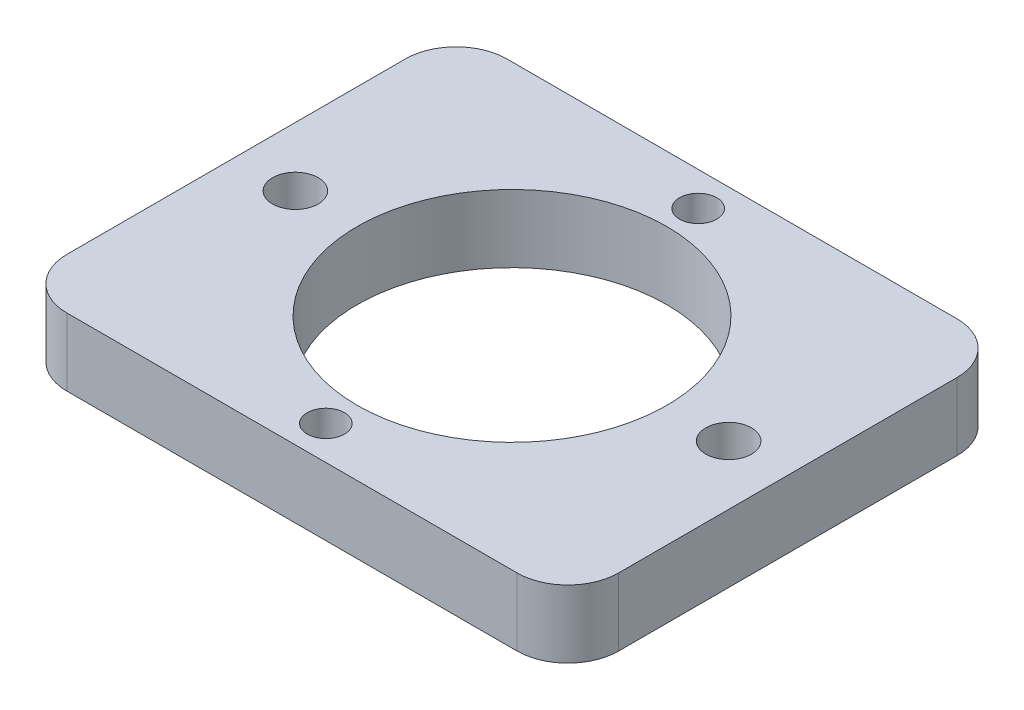
ISO-10303-21;
HEADER;
FILE_DESCRIPTION(('STEP AP214'),'2;1');
FILE_NAME('part.step','',(''),(''),'','','');
FILE_SCHEMA(('AUTOMOTIVE_DESIGN { 1 0 10303 214 1 1 1 1 }'));
ENDSEC;
DATA;
#1=APPLICATION_CONTEXT('core data for automotive mechanical design processes');
#2=APPLICATION_PROTOCOL_DEFINITION('international standard','automotive_design',2000,#1);
#3=PRODUCT_CONTEXT('',#1,'mechanical');
#4=PRODUCT('Part','Part','',(#3));
#5=PRODUCT_RELATED_PRODUCT_CATEGORY('part','',(#4));
#6=PRODUCT_DEFINITION_FORMATION('','',#4);
#7=PRODUCT_DEFINITION_CONTEXT('part definition',#1,'design');
#8=PRODUCT_DEFINITION('design','',#6,#7);
#9=PRODUCT_DEFINITION_SHAPE('','',#8);
#10=(LENGTH_UNIT() NAMED_UNIT(*) SI_UNIT(.MILLI.,.METRE.));
#11=(NAMED_UNIT(*) PLANE_ANGLE_UNIT() SI_UNIT($,.RADIAN.));
#12=(NAMED_UNIT(*) SI_UNIT($,.STERADIAN.) SOLID_ANGLE_UNIT());
#13=UNCERTAINTY_MEASURE_WITH_UNIT(LENGTH_MEASURE(1.E-05),#10,'distance_accuracy_value','');
#14=(GEOMETRIC_REPRESENTATION_CONTEXT(3) GLOBAL_UNCERTAINTY_ASSIGNED_CONTEXT((#13)) GLOBAL_UNIT_ASSIGNED_CONTEXT((#10,
#11,#12)) REPRESENTATION_CONTEXT('',''));
#15=CARTESIAN_POINT('',(0.,0.,0.));
#16=DIRECTION('',(0.,0.,1.));
#17=DIRECTION('',(1.,0.,0.));
#18=AXIS2_PLACEMENT_3D('',#15,#16,#17);
#19=CARTESIAN_POINT('',(0.,4.,0.));
#20=DIRECTION('',(1.,0.,0.));
#21=DIRECTION('',(0.,0.,-1.));
#22=AXIS2_PLACEMENT_3D('',#19,#20,#21);
#23=PLANE('',#22);
#24=DIRECTION('',(0.,0.,1.));
#25=VECTOR('',#24,1.);
#26=CARTESIAN_POINT('',(0.,0.,0.));
#27=LINE('',#26,#25);
#28=CARTESIAN_POINT('',(0.,0.,3.));
#29=VERTEX_POINT('',#28);
#30=CARTESIAN_POINT('',(0.,0.,23.));
#31=VERTEX_POINT('',#30);
#32=EDGE_CURVE('E130',#29,#31,#27,.T.);
#33=ORIENTED_EDGE('',*,*,#32,.T.);
#34=DIRECTION('',(0.,-1.,0.));
#35=VECTOR('',#34,1.);
#36=CARTESIAN_POINT('',(0.,4.,23.));
#37=LINE('',#36,#35);
#38=CARTESIAN_POINT('',(0.,4.,23.));
#39=VERTEX_POINT('',#38);
#40=EDGE_CURVE('E152',#31,#39,#37,.F.);
#41=ORIENTED_EDGE('',*,*,#40,.T.);
#42=DIRECTION('',(0.,0.,1.));
#43=VECTOR('',#42,1.);
#44=CARTESIAN_POINT('',(0.,4.,0.));
#45=LINE('',#44,#43);
#46=CARTESIAN_POINT('',(0.,4.,3.));
#47=VERTEX_POINT('',#46);
#48=EDGE_CURVE('E128',#47,#39,#45,.T.);
#49=ORIENTED_EDGE('',*,*,#48,.F.);
#50=DIRECTION('',(0.,-1.,0.));
#51=VECTOR('',#50,1.);
#52=CARTESIAN_POINT('',(0.,4.,3.));
#53=LINE('',#52,#51);
#54=EDGE_CURVE('E149',#47,#29,#53,.T.);
#55=ORIENTED_EDGE('',*,*,#54,.T.);
#56=EDGE_LOOP('',(#33,#41,#49,#55));
#57=FACE_BOUND('',#56,.T.);
#58=ADVANCED_FACE('F33',(#57),#23,.F.);
#59=CARTESIAN_POINT('',(0.,4.,26.));
#60=DIRECTION('',(0.,0.,-1.));
#61=DIRECTION('',(-1.,0.,0.));
#62=AXIS2_PLACEMENT_3D('',#59,#60,#61);
#63=PLANE('',#62);
#64=DIRECTION('',(1.,0.,0.));
#65=VECTOR('',#64,1.);
#66=CARTESIAN_POINT('',(0.,0.,26.));
#67=LINE('',#66,#65);
#68=CARTESIAN_POINT('',(3.,0.,26.));
#69=VERTEX_POINT('',#68);
#70=CARTESIAN_POINT('',(29.6,0.,26.));
#71=VERTEX_POINT('',#70);
#72=EDGE_CURVE('E126',#69,#71,#67,.T.);
#73=ORIENTED_EDGE('',*,*,#72,.T.);
#74=DIRECTION('',(0.,-1.,0.));
#75=VECTOR('',#74,1.);
#76=CARTESIAN_POINT('',(29.6,4.,26.));
#77=LINE('',#76,#75);
#78=CARTESIAN_POINT('',(29.6,4.,26.));
#79=VERTEX_POINT('',#78);
#80=EDGE_CURVE('E104',#71,#79,#77,.F.);
#81=ORIENTED_EDGE('',*,*,#80,.T.);
#82=DIRECTION('',(1.,0.,0.));
#83=VECTOR('',#82,1.);
#84=CARTESIAN_POINT('',(0.,4.,26.));
#85=LINE('',#84,#83);
#86=CARTESIAN_POINT('',(3.,4.,26.));
#87=VERTEX_POINT('',#86);
#88=EDGE_CURVE('E166',#87,#79,#85,.T.);
#89=ORIENTED_EDGE('',*,*,#88,.F.);
#90=DIRECTION('',(0.,-1.,0.));
#91=VECTOR('',#90,1.);
#92=CARTESIAN_POINT('',(3.,4.,26.));
#93=LINE('',#92,#91);
#94=EDGE_CURVE('E109',#87,#69,#93,.T.);
#95=ORIENTED_EDGE('',*,*,#94,.T.);
#96=EDGE_LOOP('',(#73,#81,#89,#95));
#97=FACE_BOUND('',#96,.T.);
#98=ADVANCED_FACE('F171',(#97),#63,.F.);
#99=CARTESIAN_POINT('',(32.6,4.,0.));
#100=DIRECTION('',(-1.,0.,0.));
#101=DIRECTION('',(0.,0.,1.));
#102=AXIS2_PLACEMENT_3D('',#99,#100,#101);
#103=PLANE('',#102);
#104=DIRECTION('',(0.,0.,-1.));
#105=VECTOR('',#104,1.);
#106=CARTESIAN_POINT('',(32.6,4.,0.));
#107=LINE('',#106,#105);
#108=CARTESIAN_POINT('',(32.6,4.,23.));
#109=VERTEX_POINT('',#108);
#110=CARTESIAN_POINT('',(32.6,4.,3.));
#111=VERTEX_POINT('',#110);
#112=EDGE_CURVE('E118',#109,#111,#107,.T.);
#113=ORIENTED_EDGE('',*,*,#112,.F.);
#114=DIRECTION('',(0.,-1.,0.));
#115=VECTOR('',#114,1.);
#116=CARTESIAN_POINT('',(32.6,4.,23.));
#117=LINE('',#116,#115);
#118=CARTESIAN_POINT('',(32.6,0.,23.));
#119=VERTEX_POINT('',#118);
#120=EDGE_CURVE('E103',#109,#119,#117,.T.);
#121=ORIENTED_EDGE('',*,*,#120,.T.);
#122=DIRECTION('',(0.,0.,-1.));
#123=VECTOR('',#122,1.);
#124=CARTESIAN_POINT('',(32.6,0.,0.));
#125=LINE('',#124,#123);
#126=CARTESIAN_POINT('',(32.6,0.,3.));
#127=VERTEX_POINT('',#126);
#128=EDGE_CURVE('E116',#119,#127,#125,.T.);
#129=ORIENTED_EDGE('',*,*,#128,.T.);
#130=DIRECTION('',(0.,-1.,0.));
#131=VECTOR('',#130,1.);
#132=CARTESIAN_POINT('',(32.6,4.,3.));
#133=LINE('',#132,#131);
#134=EDGE_CURVE('E120',#127,#111,#133,.F.);
#135=ORIENTED_EDGE('',*,*,#134,.T.);
#136=EDGE_LOOP('',(#113,#121,#129,#135));
#137=FACE_BOUND('',#136,.T.);
#138=ADVANCED_FACE('F115',(#137),#103,.F.);
#139=CARTESIAN_POINT('',(0.,4.,0.));
#140=DIRECTION('',(0.,0.,1.));
#141=DIRECTION('',(1.,0.,0.));
#142=AXIS2_PLACEMENT_3D('',#139,#140,#141);
#143=PLANE('',#142);
#144=DIRECTION('',(-1.,0.,0.));
#145=VECTOR('',#144,1.);
#146=CARTESIAN_POINT('',(0.,4.,0.));
#147=LINE('',#146,#145);
#148=CARTESIAN_POINT('',(29.6,4.,0.));
#149=VERTEX_POINT('',#148);
#150=CARTESIAN_POINT('',(3.,4.,0.));
#151=VERTEX_POINT('',#150);
#152=EDGE_CURVE('E134',#149,#151,#147,.T.);
#153=ORIENTED_EDGE('',*,*,#152,.F.);
#154=DIRECTION('',(0.,-1.,0.));
#155=VECTOR('',#154,1.);
#156=CARTESIAN_POINT('',(29.6,4.,0.));
#157=LINE('',#156,#155);
#158=CARTESIAN_POINT('',(29.6,0.,0.));
#159=VERTEX_POINT('',#158);
#160=EDGE_CURVE('E11',#149,#159,#157,.T.);
#161=ORIENTED_EDGE('',*,*,#160,.T.);
#162=DIRECTION('',(-1.,0.,0.));
#163=VECTOR('',#162,1.);
#164=CARTESIAN_POINT('',(0.,0.,0.));
#165=LINE('',#164,#163);
#166=CARTESIAN_POINT('',(3.,0.,0.));
#167=VERTEX_POINT('',#166);
#168=EDGE_CURVE('E125',#159,#167,#165,.T.);
#169=ORIENTED_EDGE('',*,*,#168,.T.);
#170=DIRECTION('',(0.,-1.,0.));
#171=VECTOR('',#170,1.);
#172=CARTESIAN_POINT('',(3.,4.,0.));
#173=LINE('',#172,#171);
#174=EDGE_CURVE('E41',#167,#151,#173,.F.);
#175=ORIENTED_EDGE('',*,*,#174,.T.);
#176=EDGE_LOOP('',(#153,#161,#169,#175));
#177=FACE_BOUND('',#176,.T.);
#178=ADVANCED_FACE('F219',(#177),#143,.F.);
#179=CARTESIAN_POINT('',(0.,4.,0.));
#180=DIRECTION('',(0.,1.,0.));
#181=DIRECTION('',(0.,0.,1.));
#182=AXIS2_PLACEMENT_3D('',#179,#180,#181);
#183=PLANE('',#182);
#184=CARTESIAN_POINT('',(16.3,4.,24.));
#185=DIRECTION('',(0.,1.,0.));
#186=DIRECTION('',(0.,0.,1.));
#187=AXIS2_PLACEMENT_3D('',#184,#185,#186);
#188=CIRCLE('',#187,1.1);
#189=CARTESIAN_POINT('',(16.3,4.,25.1));
#190=VERTEX_POINT('',#189);
#191=EDGE_CURVE('E195',#190,#190,#188,.T.);
#192=ORIENTED_EDGE('',*,*,#191,.F.);
#193=EDGE_LOOP('',(#192));
#194=FACE_BOUND('',#193,.T.);
#195=CARTESIAN_POINT('',(16.3,4.,2.));
#196=DIRECTION('',(0.,1.,0.));
#197=DIRECTION('',(0.,0.,1.));
#198=AXIS2_PLACEMENT_3D('',#195,#196,#197);
#199=CIRCLE('',#198,1.1);
#200=CARTESIAN_POINT('',(16.3,4.,3.1));
#201=VERTEX_POINT('',#200);
#202=EDGE_CURVE('E201',#201,#201,#199,.T.);
#203=ORIENTED_EDGE('',*,*,#202,.F.);
#204=EDGE_LOOP('',(#203));
#205=FACE_BOUND('',#204,.T.);
#206=CARTESIAN_POINT('',(29.1,4.,13.));
#207=DIRECTION('',(0.,1.,0.));
#208=DIRECTION('',(0.,0.,1.));
#209=AXIS2_PLACEMENT_3D('',#206,#207,#208);
#210=CIRCLE('',#209,1.35);
#211=CARTESIAN_POINT('',(29.1,4.,14.35));
#212=VERTEX_POINT('',#211);
#213=EDGE_CURVE('E183',#212,#212,#210,.T.);
#214=ORIENTED_EDGE('',*,*,#213,.F.);
#215=EDGE_LOOP('',(#214));
#216=FACE_BOUND('',#215,.T.);
#217=CARTESIAN_POINT('',(3.5,4.,13.));
#218=DIRECTION('',(0.,1.,0.));
#219=DIRECTION('',(0.,0.,1.));
#220=AXIS2_PLACEMENT_3D('',#217,#218,#219);
#221=CIRCLE('',#220,1.35);
#222=CARTESIAN_POINT('',(3.5,4.,14.35));
#223=VERTEX_POINT('',#222);
#224=EDGE_CURVE('E190',#223,#223,#221,.T.);
#225=ORIENTED_EDGE('',*,*,#224,.F.);
#226=EDGE_LOOP('',(#225));
#227=FACE_BOUND('',#226,.T.);
#228=CARTESIAN_POINT('',(16.3,4.,13.));
#229=DIRECTION('',(0.,1.,0.));
#230=DIRECTION('',(0.,0.,1.));
#231=AXIS2_PLACEMENT_3D('',#228,#229,#230);
#232=CIRCLE('',#231,9.15);
#233=CARTESIAN_POINT('',(16.3,4.,22.15));
#234=VERTEX_POINT('',#233);
#235=EDGE_CURVE('E174',#234,#234,#232,.T.);
#236=ORIENTED_EDGE('',*,*,#235,.F.);
#237=EDGE_LOOP('',(#236));
#238=FACE_BOUND('',#237,.T.);
#239=ORIENTED_EDGE('',*,*,#88,.T.);
#240=CARTESIAN_POINT('',(29.6,4.,23.));
#241=DIRECTION('',(0.,1.,0.));
#242=DIRECTION('',(0.,0.,1.));
#243=AXIS2_PLACEMENT_3D('',#240,#241,#242);
#244=CIRCLE('',#243,3.);
#245=EDGE_CURVE('E147',#79,#109,#244,.T.);
#246=ORIENTED_EDGE('',*,*,#245,.T.);
#247=ORIENTED_EDGE('',*,*,#112,.T.);
#248=CARTESIAN_POINT('',(29.6,4.,3.));
#249=DIRECTION('',(0.,1.,0.));
#250=DIRECTION('',(0.,0.,1.));
#251=AXIS2_PLACEMENT_3D('',#248,#249,#250);
#252=CIRCLE('',#251,3.);
#253=EDGE_CURVE('E54',#111,#149,#252,.T.);
#254=ORIENTED_EDGE('',*,*,#253,.T.);
#255=ORIENTED_EDGE('',*,*,#152,.T.);
#256=CARTESIAN_POINT('',(3.,4.,3.));
#257=DIRECTION('',(0.,1.,0.));
#258=DIRECTION('',(0.,0.,1.));
#259=AXIS2_PLACEMENT_3D('',#256,#257,#258);
#260=CIRCLE('',#259,3.);
#261=EDGE_CURVE('E142',#151,#47,#260,.T.);
#262=ORIENTED_EDGE('',*,*,#261,.T.);
#263=ORIENTED_EDGE('',*,*,#48,.T.);
#264=CARTESIAN_POINT('',(3.,4.,23.));
#265=DIRECTION('',(0.,1.,0.));
#266=DIRECTION('',(0.,0.,1.));
#267=AXIS2_PLACEMENT_3D('',#264,#265,#266);
#268=CIRCLE('',#267,3.);
#269=EDGE_CURVE('E145',#39,#87,#268,.T.);
#270=ORIENTED_EDGE('',*,*,#269,.T.);
#271=EDGE_LOOP('',(#239,#246,#247,#254,#255,#262,#263,#270));
#272=FACE_BOUND('',#271,.T.);
#273=ADVANCED_FACE('F163',(#194,#205,#216,#227,#238,#272),#183,.T.);
#274=CARTESIAN_POINT('',(0.,0.,0.));
#275=DIRECTION('',(0.,1.,0.));
#276=DIRECTION('',(0.,0.,1.));
#277=AXIS2_PLACEMENT_3D('',#274,#275,#276);
#278=PLANE('',#277);
#279=CARTESIAN_POINT('',(16.3,0.,24.));
#280=DIRECTION('',(0.,1.,0.));
#281=DIRECTION('',(0.,0.,1.));
#282=AXIS2_PLACEMENT_3D('',#279,#280,#281);
#283=CIRCLE('',#282,1.1);
#284=CARTESIAN_POINT('',(16.3,0.,25.1));
#285=VERTEX_POINT('',#284);
#286=EDGE_CURVE('E198',#285,#285,#283,.T.);
#287=ORIENTED_EDGE('',*,*,#286,.T.);
#288=EDGE_LOOP('',(#287));
#289=FACE_BOUND('',#288,.T.);
#290=CARTESIAN_POINT('',(16.3,0.,2.));
#291=DIRECTION('',(0.,1.,0.));
#292=DIRECTION('',(0.,0.,1.));
#293=AXIS2_PLACEMENT_3D('',#290,#291,#292);
#294=CIRCLE('',#293,1.1);
#295=CARTESIAN_POINT('',(16.3,0.,3.1));
#296=VERTEX_POINT('',#295);
#297=EDGE_CURVE('E187',#296,#296,#294,.T.);
#298=ORIENTED_EDGE('',*,*,#297,.T.);
#299=EDGE_LOOP('',(#298));
#300=FACE_BOUND('',#299,.T.);
#301=CARTESIAN_POINT('',(29.1,0.,13.));
#302=DIRECTION('',(0.,1.,0.));
#303=DIRECTION('',(0.,0.,1.));
#304=AXIS2_PLACEMENT_3D('',#301,#302,#303);
#305=CIRCLE('',#304,1.35);
#306=CARTESIAN_POINT('',(29.1,0.,14.35));
#307=VERTEX_POINT('',#306);
#308=EDGE_CURVE('E186',#307,#307,#305,.T.);
#309=ORIENTED_EDGE('',*,*,#308,.T.);
#310=EDGE_LOOP('',(#309));
#311=FACE_BOUND('',#310,.T.);
#312=CARTESIAN_POINT('',(3.5,0.,13.));
#313=DIRECTION('',(0.,1.,0.));
#314=DIRECTION('',(0.,0.,1.));
#315=AXIS2_PLACEMENT_3D('',#312,#313,#314);
#316=CIRCLE('',#315,1.35);
#317=CARTESIAN_POINT('',(3.5,0.,14.35));
#318=VERTEX_POINT('',#317);
#319=EDGE_CURVE('E181',#318,#318,#316,.T.);
#320=ORIENTED_EDGE('',*,*,#319,.T.);
#321=EDGE_LOOP('',(#320));
#322=FACE_BOUND('',#321,.T.);
#323=CARTESIAN_POINT('',(16.3,0.,13.));
#324=DIRECTION('',(0.,1.,0.));
#325=DIRECTION('',(0.,0.,1.));
#326=AXIS2_PLACEMENT_3D('',#323,#324,#325);
#327=CIRCLE('',#326,9.15);
#328=CARTESIAN_POINT('',(16.3,0.,22.15));
#329=VERTEX_POINT('',#328);
#330=EDGE_CURVE('E172',#329,#329,#327,.T.);
#331=ORIENTED_EDGE('',*,*,#330,.T.);
#332=EDGE_LOOP('',(#331));
#333=FACE_BOUND('',#332,.T.);
#334=ORIENTED_EDGE('',*,*,#128,.F.);
#335=CARTESIAN_POINT('',(29.6,0.,23.));
#336=DIRECTION('',(0.,1.,0.));
#337=DIRECTION('',(0.,0.,1.));
#338=AXIS2_PLACEMENT_3D('',#335,#336,#337);
#339=CIRCLE('',#338,3.);
#340=EDGE_CURVE('E99',#119,#71,#339,.F.);
#341=ORIENTED_EDGE('',*,*,#340,.T.);
#342=ORIENTED_EDGE('',*,*,#72,.F.);
#343=CARTESIAN_POINT('',(3.,0.,23.));
#344=DIRECTION('',(0.,1.,0.));
#345=DIRECTION('',(0.,0.,1.));
#346=AXIS2_PLACEMENT_3D('',#343,#344,#345);
#347=CIRCLE('',#346,3.);
#348=EDGE_CURVE('E110',#69,#31,#347,.F.);
#349=ORIENTED_EDGE('',*,*,#348,.T.);
#350=ORIENTED_EDGE('',*,*,#32,.F.);
#351=CARTESIAN_POINT('',(3.,0.,3.));
#352=DIRECTION('',(0.,1.,0.));
#353=DIRECTION('',(0.,0.,1.));
#354=AXIS2_PLACEMENT_3D('',#351,#352,#353);
#355=CIRCLE('',#354,3.);
#356=EDGE_CURVE('E119',#29,#167,#355,.F.);
#357=ORIENTED_EDGE('',*,*,#356,.T.);
#358=ORIENTED_EDGE('',*,*,#168,.F.);
#359=CARTESIAN_POINT('',(29.6,0.,3.));
#360=DIRECTION('',(0.,1.,0.));
#361=DIRECTION('',(0.,0.,1.));
#362=AXIS2_PLACEMENT_3D('',#359,#360,#361);
#363=CIRCLE('',#362,3.);
#364=EDGE_CURVE('E124',#159,#127,#363,.F.);
#365=ORIENTED_EDGE('',*,*,#364,.T.);
#366=EDGE_LOOP('',(#334,#341,#342,#349,#350,#357,#358,#365));
#367=FACE_BOUND('',#366,.T.);
#368=ADVANCED_FACE('F122',(#289,#300,#311,#322,#333,#367),#278,.F.);
#369=CARTESIAN_POINT('',(16.3,0.,13.));
#370=DIRECTION('',(0.,1.,0.));
#371=DIRECTION('',(0.,0.,1.));
#372=AXIS2_PLACEMENT_3D('',#369,#370,#371);
#373=CYLINDRICAL_SURFACE('',#372,9.15);
#374=ORIENTED_EDGE('',*,*,#330,.F.);
#375=EDGE_LOOP('',(#374));
#376=FACE_BOUND('',#375,.T.);
#377=ORIENTED_EDGE('',*,*,#235,.T.);
#378=EDGE_LOOP('',(#377));
#379=FACE_BOUND('',#378,.T.);
#380=ADVANCED_FACE('F228',(#376,#379),#373,.F.);
#381=CARTESIAN_POINT('',(3.5,0.,13.));
#382=DIRECTION('',(0.,1.,0.));
#383=DIRECTION('',(0.,0.,1.));
#384=AXIS2_PLACEMENT_3D('',#381,#382,#383);
#385=CYLINDRICAL_SURFACE('',#384,1.35);
#386=ORIENTED_EDGE('',*,*,#319,.F.);
#387=EDGE_LOOP('',(#386));
#388=FACE_BOUND('',#387,.T.);
#389=ORIENTED_EDGE('',*,*,#224,.T.);
#390=EDGE_LOOP('',(#389));
#391=FACE_BOUND('',#390,.T.);
#392=ADVANCED_FACE('F230',(#388,#391),#385,.F.);
#393=CARTESIAN_POINT('',(29.1,0.,13.));
#394=DIRECTION('',(0.,1.,0.));
#395=DIRECTION('',(0.,0.,1.));
#396=AXIS2_PLACEMENT_3D('',#393,#394,#395);
#397=CYLINDRICAL_SURFACE('',#396,1.35);
#398=ORIENTED_EDGE('',*,*,#308,.F.);
#399=EDGE_LOOP('',(#398));
#400=FACE_BOUND('',#399,.T.);
#401=ORIENTED_EDGE('',*,*,#213,.T.);
#402=EDGE_LOOP('',(#401));
#403=FACE_BOUND('',#402,.T.);
#404=ADVANCED_FACE('F213',(#400,#403),#397,.F.);
#405=CARTESIAN_POINT('',(16.3,0.,2.));
#406=DIRECTION('',(0.,1.,0.));
#407=DIRECTION('',(0.,0.,1.));
#408=AXIS2_PLACEMENT_3D('',#405,#406,#407);
#409=CYLINDRICAL_SURFACE('',#408,1.1);
#410=ORIENTED_EDGE('',*,*,#297,.F.);
#411=EDGE_LOOP('',(#410));
#412=FACE_BOUND('',#411,.T.);
#413=ORIENTED_EDGE('',*,*,#202,.T.);
#414=EDGE_LOOP('',(#413));
#415=FACE_BOUND('',#414,.T.);
#416=ADVANCED_FACE('F209',(#412,#415),#409,.F.);
#417=CARTESIAN_POINT('',(16.3,0.,24.));
#418=DIRECTION('',(0.,1.,0.));
#419=DIRECTION('',(0.,0.,1.));
#420=AXIS2_PLACEMENT_3D('',#417,#418,#419);
#421=CYLINDRICAL_SURFACE('',#420,1.1);
#422=ORIENTED_EDGE('',*,*,#286,.F.);
#423=EDGE_LOOP('',(#422));
#424=FACE_BOUND('',#423,.T.);
#425=ORIENTED_EDGE('',*,*,#191,.T.);
#426=EDGE_LOOP('',(#425));
#427=FACE_BOUND('',#426,.T.);
#428=ADVANCED_FACE('F212',(#424,#427),#421,.F.);
#429=CARTESIAN_POINT('',(29.6,4.,23.));
#430=DIRECTION('',(0.,-1.,0.));
#431=DIRECTION('',(0.,0.,-1.));
#432=AXIS2_PLACEMENT_3D('',#429,#430,#431);
#433=CYLINDRICAL_SURFACE('',#432,3.);
#434=ORIENTED_EDGE('',*,*,#245,.F.);
#435=ORIENTED_EDGE('',*,*,#80,.F.);
#436=ORIENTED_EDGE('',*,*,#340,.F.);
#437=ORIENTED_EDGE('',*,*,#120,.F.);
#438=EDGE_LOOP('',(#434,#435,#436,#437));
#439=FACE_BOUND('',#438,.T.);
#440=ADVANCED_FACE('F102',(#439),#433,.T.);
#441=CARTESIAN_POINT('',(3.,4.,23.));
#442=DIRECTION('',(0.,-1.,0.));
#443=DIRECTION('',(0.,0.,-1.));
#444=AXIS2_PLACEMENT_3D('',#441,#442,#443);
#445=CYLINDRICAL_SURFACE('',#444,3.);
#446=ORIENTED_EDGE('',*,*,#269,.F.);
#447=ORIENTED_EDGE('',*,*,#40,.F.);
#448=ORIENTED_EDGE('',*,*,#348,.F.);
#449=ORIENTED_EDGE('',*,*,#94,.F.);
#450=EDGE_LOOP('',(#446,#447,#448,#449));
#451=FACE_BOUND('',#450,.T.);
#452=ADVANCED_FACE('F169',(#451),#445,.T.);
#453=CARTESIAN_POINT('',(29.6,4.,3.));
#454=DIRECTION('',(0.,-1.,0.));
#455=DIRECTION('',(0.,0.,-1.));
#456=AXIS2_PLACEMENT_3D('',#453,#454,#455);
#457=CYLINDRICAL_SURFACE('',#456,3.);
#458=ORIENTED_EDGE('',*,*,#253,.F.);
#459=ORIENTED_EDGE('',*,*,#134,.F.);
#460=ORIENTED_EDGE('',*,*,#364,.F.);
#461=ORIENTED_EDGE('',*,*,#160,.F.);
#462=EDGE_LOOP('',(#458,#459,#460,#461));
#463=FACE_BOUND('',#462,.T.);
#464=ADVANCED_FACE('F254',(#463),#457,.T.);
#465=CARTESIAN_POINT('',(3.,4.,3.));
#466=DIRECTION('',(0.,-1.,0.));
#467=DIRECTION('',(0.,0.,-1.));
#468=AXIS2_PLACEMENT_3D('',#465,#466,#467);
#469=CYLINDRICAL_SURFACE('',#468,3.);
#470=ORIENTED_EDGE('',*,*,#261,.F.);
#471=ORIENTED_EDGE('',*,*,#174,.F.);
#472=ORIENTED_EDGE('',*,*,#356,.F.);
#473=ORIENTED_EDGE('',*,*,#54,.F.);
#474=EDGE_LOOP('',(#470,#471,#472,#473));
#475=FACE_BOUND('',#474,.T.);
#476=ADVANCED_FACE('F35',(#475),#469,.T.);
#477=CLOSED_SHELL('',(#58,#98,#138,#178,#273,#368,#380,#392,#404,#416,#428,#440,#452,#464,#476));
#478=MANIFOLD_SOLID_BREP('B2',#477);
#479=ADVANCED_BREP_SHAPE_REPRESENTATION('',(#18,#478),#14);
#480=SHAPE_DEFINITION_REPRESENTATION(#9,#479);
ENDSEC;
END-ISO-10303-21;
